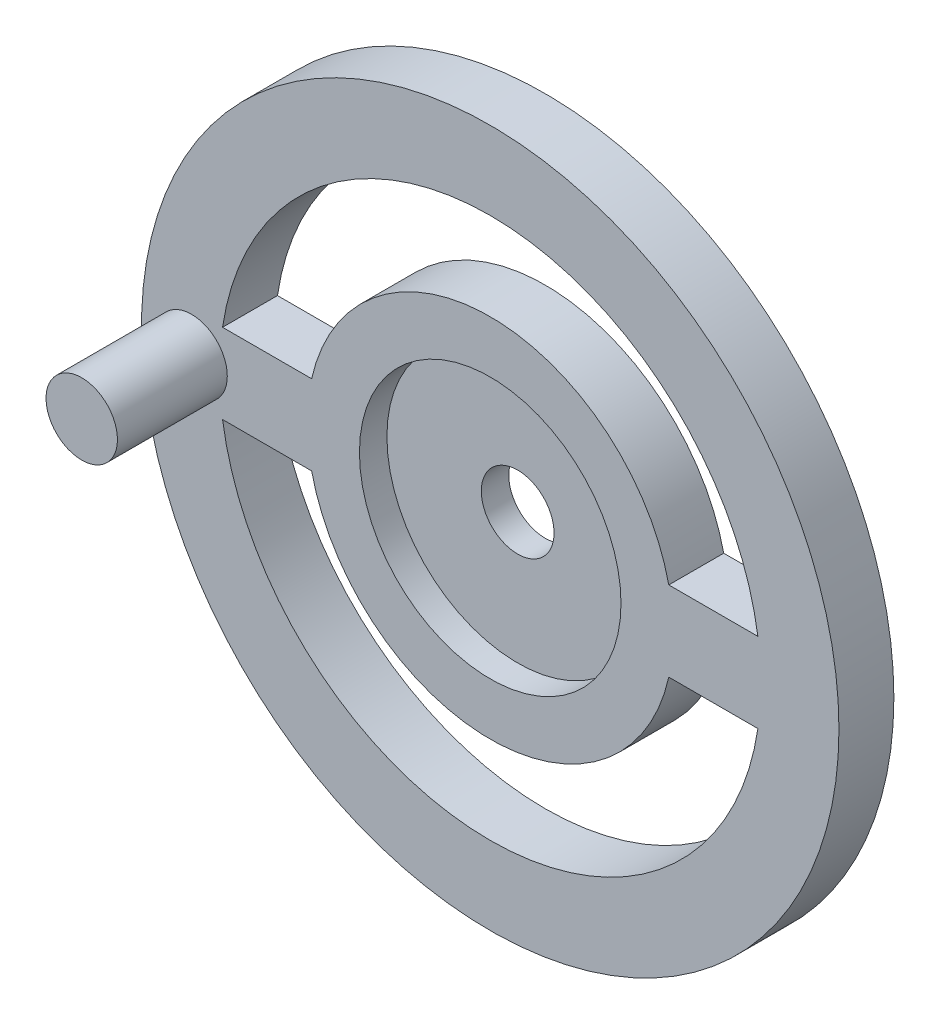
ISO-10303-21;
HEADER;
FILE_DESCRIPTION(('STEP AP214'),'2;1');
FILE_NAME('part.step','',(''),(''),'','','');
FILE_SCHEMA(('AUTOMOTIVE_DESIGN { 1 0 10303 214 1 1 1 1 }'));
ENDSEC;
DATA;
#1=APPLICATION_CONTEXT('core data for automotive mechanical design processes');
#2=APPLICATION_PROTOCOL_DEFINITION('international standard','automotive_design',2000,#1);
#3=PRODUCT_CONTEXT('',#1,'mechanical');
#4=PRODUCT('Part','Part','',(#3));
#5=PRODUCT_RELATED_PRODUCT_CATEGORY('part','',(#4));
#6=PRODUCT_DEFINITION_FORMATION('','',#4);
#7=PRODUCT_DEFINITION_CONTEXT('part definition',#1,'design');
#8=PRODUCT_DEFINITION('design','',#6,#7);
#9=PRODUCT_DEFINITION_SHAPE('','',#8);
#10=(LENGTH_UNIT() NAMED_UNIT(*) SI_UNIT(.MILLI.,.METRE.));
#11=(NAMED_UNIT(*) PLANE_ANGLE_UNIT() SI_UNIT($,.RADIAN.));
#12=(NAMED_UNIT(*) SI_UNIT($,.STERADIAN.) SOLID_ANGLE_UNIT());
#13=UNCERTAINTY_MEASURE_WITH_UNIT(LENGTH_MEASURE(1.E-05),#10,'distance_accuracy_value','');
#14=(GEOMETRIC_REPRESENTATION_CONTEXT(3) GLOBAL_UNCERTAINTY_ASSIGNED_CONTEXT((#13)) GLOBAL_UNIT_ASSIGNED_CONTEXT((#10,
#11,#12)) REPRESENTATION_CONTEXT('',''));
#15=CARTESIAN_POINT('',(0.,0.,0.));
#16=DIRECTION('',(0.,0.,1.));
#17=DIRECTION('',(1.,0.,0.));
#18=AXIS2_PLACEMENT_3D('',#15,#16,#17);
#19=CARTESIAN_POINT('',(674.616590385482,-1255.03673865925,4.));
#20=DIRECTION('',(0.,0.,1.));
#21=DIRECTION('',(1.,0.,0.));
#22=AXIS2_PLACEMENT_3D('',#19,#20,#21);
#23=PLANE('',#22);
#24=CARTESIAN_POINT('',(674.616590385482,-1255.03673865925,4.));
#25=DIRECTION('',(0.,0.,1.));
#26=DIRECTION('',(1.,0.,0.));
#27=AXIS2_PLACEMENT_3D('',#24,#25,#26);
#28=CIRCLE('',#27,9.52500000000005);
#29=CARTESIAN_POINT('',(684.141590385482,-1255.03673865925,4.));
#30=VERTEX_POINT('',#29);
#31=EDGE_CURVE('E49',#30,#30,#28,.T.);
#32=ORIENTED_EDGE('',*,*,#31,.F.);
#33=EDGE_LOOP('',(#32));
#34=FACE_BOUND('',#33,.T.);
#35=CARTESIAN_POINT('',(652.866731086859,-1255.03673865925,4.));
#36=DIRECTION('',(0.,0.,1.));
#37=DIRECTION('',(1.,0.,0.));
#38=AXIS2_PLACEMENT_3D('',#35,#36,#37);
#39=CIRCLE('',#38,2.60000000000008);
#40=CARTESIAN_POINT('',(655.466731086859,-1255.03673865925,4.));
#41=VERTEX_POINT('',#40);
#42=EDGE_CURVE('E220',#41,#41,#39,.T.);
#43=ORIENTED_EDGE('',*,*,#42,.F.);
#44=EDGE_LOOP('',(#43));
#45=FACE_BOUND('',#44,.T.);
#46=DIRECTION('',(1.,0.,0.));
#47=VECTOR('',#46,1.);
#48=CARTESIAN_POINT('',(694.110809965282,-1252.12881268514,4.));
#49=LINE('',#48,#47);
#50=CARTESIAN_POINT('',(687.622405761052,-1252.12881268514,4.));
#51=VERTEX_POINT('',#50);
#52=CARTESIAN_POINT('',(694.110809965282,-1252.12881268514,4.));
#53=VERTEX_POINT('',#52);
#54=EDGE_CURVE('E170',#51,#53,#49,.T.);
#55=ORIENTED_EDGE('',*,*,#54,.F.);
#56=CARTESIAN_POINT('',(674.616590385482,-1255.03673865925,4.));
#57=DIRECTION('',(0.,0.,-1.));
#58=DIRECTION('',(1.,0.,0.));
#59=AXIS2_PLACEMENT_3D('',#56,#57,#58);
#60=CIRCLE('',#59,13.3269376472712);
#61=CARTESIAN_POINT('',(661.610775009912,-1252.12881268514,4.));
#62=VERTEX_POINT('',#61);
#63=EDGE_CURVE('E167',#62,#51,#60,.T.);
#64=ORIENTED_EDGE('',*,*,#63,.F.);
#65=DIRECTION('',(1.,0.,0.));
#66=VECTOR('',#65,1.);
#67=CARTESIAN_POINT('',(661.610775009912,-1252.12881268514,4.));
#68=LINE('',#67,#66);
#69=CARTESIAN_POINT('',(655.122370805682,-1252.12881268514,4.));
#70=VERTEX_POINT('',#69);
#71=EDGE_CURVE('E178',#70,#62,#68,.T.);
#72=ORIENTED_EDGE('',*,*,#71,.F.);
#73=CARTESIAN_POINT('',(674.616590385482,-1255.03673865925,4.));
#74=DIRECTION('',(0.,0.,1.));
#75=DIRECTION('',(1.,0.,0.));
#76=AXIS2_PLACEMENT_3D('',#73,#74,#75);
#77=CIRCLE('',#76,19.7099119860112);
#78=EDGE_CURVE('E174',#53,#70,#77,.T.);
#79=ORIENTED_EDGE('',*,*,#78,.F.);
#80=EDGE_LOOP('',(#55,#64,#72,#79));
#81=FACE_BOUND('',#80,.T.);
#82=CARTESIAN_POINT('',(674.616590385482,-1255.03673865925,4.));
#83=DIRECTION('',(0.,0.,1.));
#84=DIRECTION('',(1.,0.,0.));
#85=AXIS2_PLACEMENT_3D('',#82,#83,#84);
#86=CIRCLE('',#85,25.4000000000007);
#87=CARTESIAN_POINT('',(700.016590385483,-1255.03673865925,4.));
#88=VERTEX_POINT('',#87);
#89=EDGE_CURVE('E11',#88,#88,#86,.T.);
#90=ORIENTED_EDGE('',*,*,#89,.T.);
#91=EDGE_LOOP('',(#90));
#92=FACE_BOUND('',#91,.T.);
#93=DIRECTION('',(-1.,0.,0.));
#94=VECTOR('',#93,1.);
#95=CARTESIAN_POINT('',(661.610775009913,-1257.94466463335,4.));
#96=LINE('',#95,#94);
#97=CARTESIAN_POINT('',(661.610775009913,-1257.94466463335,4.));
#98=VERTEX_POINT('',#97);
#99=CARTESIAN_POINT('',(655.122370805682,-1257.94466463335,4.));
#100=VERTEX_POINT('',#99);
#101=EDGE_CURVE('E122',#98,#100,#96,.T.);
#102=ORIENTED_EDGE('',*,*,#101,.F.);
#103=CARTESIAN_POINT('',(674.616590385482,-1255.03673865925,4.));
#104=DIRECTION('',(0.,0.,-1.));
#105=DIRECTION('',(1.,0.,0.));
#106=AXIS2_PLACEMENT_3D('',#103,#104,#105);
#107=CIRCLE('',#106,13.3269376472713);
#108=CARTESIAN_POINT('',(687.622405761052,-1257.94466463335,4.));
#109=VERTEX_POINT('',#108);
#110=EDGE_CURVE('E113',#109,#98,#107,.T.);
#111=ORIENTED_EDGE('',*,*,#110,.F.);
#112=DIRECTION('',(-1.,0.,0.));
#113=VECTOR('',#112,1.);
#114=CARTESIAN_POINT('',(694.110809965282,-1257.94466463335,4.));
#115=LINE('',#114,#113);
#116=CARTESIAN_POINT('',(694.110809965282,-1257.94466463335,4.));
#117=VERTEX_POINT('',#116);
#118=EDGE_CURVE('E139',#117,#109,#115,.T.);
#119=ORIENTED_EDGE('',*,*,#118,.F.);
#120=CARTESIAN_POINT('',(674.616590385482,-1255.03673865925,4.));
#121=DIRECTION('',(0.,0.,1.));
#122=DIRECTION('',(1.,0.,0.));
#123=AXIS2_PLACEMENT_3D('',#120,#121,#122);
#124=CIRCLE('',#123,19.7099119860111);
#125=EDGE_CURVE('E135',#100,#117,#124,.T.);
#126=ORIENTED_EDGE('',*,*,#125,.F.);
#127=EDGE_LOOP('',(#102,#111,#119,#126));
#128=FACE_BOUND('',#127,.T.);
#129=ADVANCED_FACE('F45',(#34,#45,#81,#92,#128),#23,.T.);
#130=CARTESIAN_POINT('',(674.616590385482,-1255.03673865925,0.));
#131=DIRECTION('',(0.,0.,1.));
#132=DIRECTION('',(1.,0.,0.));
#133=AXIS2_PLACEMENT_3D('',#130,#131,#132);
#134=PLANE('',#133);
#135=CARTESIAN_POINT('',(674.616590385482,-1255.03673865925,0.));
#136=DIRECTION('',(0.,0.,1.));
#137=DIRECTION('',(1.,0.,0.));
#138=AXIS2_PLACEMENT_3D('',#135,#136,#137);
#139=CIRCLE('',#138,2.65000000000069);
#140=CARTESIAN_POINT('',(677.266590385483,-1255.03673865925,0.));
#141=VERTEX_POINT('',#140);
#142=EDGE_CURVE('E131',#141,#141,#139,.T.);
#143=ORIENTED_EDGE('',*,*,#142,.T.);
#144=EDGE_LOOP('',(#143));
#145=FACE_BOUND('',#144,.T.);
#146=CARTESIAN_POINT('',(674.616590385482,-1255.03673865925,0.));
#147=DIRECTION('',(0.,0.,-1.));
#148=DIRECTION('',(1.,0.,0.));
#149=AXIS2_PLACEMENT_3D('',#146,#147,#148);
#150=CIRCLE('',#149,13.3269376472712);
#151=CARTESIAN_POINT('',(661.610775009912,-1252.12881268514,0.));
#152=VERTEX_POINT('',#151);
#153=CARTESIAN_POINT('',(687.622405761052,-1252.12881268514,0.));
#154=VERTEX_POINT('',#153);
#155=EDGE_CURVE('E166',#152,#154,#150,.T.);
#156=ORIENTED_EDGE('',*,*,#155,.T.);
#157=DIRECTION('',(1.,0.,0.));
#158=VECTOR('',#157,1.);
#159=CARTESIAN_POINT('',(694.110809965282,-1252.12881268514,0.));
#160=LINE('',#159,#158);
#161=CARTESIAN_POINT('',(694.110809965282,-1252.12881268514,0.));
#162=VERTEX_POINT('',#161);
#163=EDGE_CURVE('E185',#154,#162,#160,.T.);
#164=ORIENTED_EDGE('',*,*,#163,.T.);
#165=CARTESIAN_POINT('',(674.616590385482,-1255.03673865925,0.));
#166=DIRECTION('',(0.,0.,1.));
#167=DIRECTION('',(1.,0.,0.));
#168=AXIS2_PLACEMENT_3D('',#165,#166,#167);
#169=CIRCLE('',#168,19.7099119860112);
#170=CARTESIAN_POINT('',(655.122370805682,-1252.12881268514,0.));
#171=VERTEX_POINT('',#170);
#172=EDGE_CURVE('E189',#162,#171,#169,.T.);
#173=ORIENTED_EDGE('',*,*,#172,.T.);
#174=DIRECTION('',(1.,0.,0.));
#175=VECTOR('',#174,1.);
#176=CARTESIAN_POINT('',(661.610775009912,-1252.12881268514,0.));
#177=LINE('',#176,#175);
#178=EDGE_CURVE('E171',#171,#152,#177,.T.);
#179=ORIENTED_EDGE('',*,*,#178,.T.);
#180=EDGE_LOOP('',(#156,#164,#173,#179));
#181=FACE_BOUND('',#180,.T.);
#182=CARTESIAN_POINT('',(674.616590385482,-1255.03673865925,0.));
#183=DIRECTION('',(0.,0.,1.));
#184=DIRECTION('',(1.,0.,0.));
#185=AXIS2_PLACEMENT_3D('',#182,#183,#184);
#186=CIRCLE('',#185,25.4000000000007);
#187=CARTESIAN_POINT('',(700.016590385483,-1255.03673865925,0.));
#188=VERTEX_POINT('',#187);
#189=EDGE_CURVE('E55',#188,#188,#186,.T.);
#190=ORIENTED_EDGE('',*,*,#189,.F.);
#191=EDGE_LOOP('',(#190));
#192=FACE_BOUND('',#191,.T.);
#193=CARTESIAN_POINT('',(674.616590385482,-1255.03673865925,0.));
#194=DIRECTION('',(0.,0.,-1.));
#195=DIRECTION('',(1.,0.,0.));
#196=AXIS2_PLACEMENT_3D('',#193,#194,#195);
#197=CIRCLE('',#196,13.3269376472713);
#198=CARTESIAN_POINT('',(687.622405761052,-1257.94466463335,0.));
#199=VERTEX_POINT('',#198);
#200=CARTESIAN_POINT('',(661.610775009913,-1257.94466463335,0.));
#201=VERTEX_POINT('',#200);
#202=EDGE_CURVE('E71',#199,#201,#197,.T.);
#203=ORIENTED_EDGE('',*,*,#202,.T.);
#204=DIRECTION('',(-1.,0.,0.));
#205=VECTOR('',#204,1.);
#206=CARTESIAN_POINT('',(661.610775009913,-1257.94466463335,0.));
#207=LINE('',#206,#205);
#208=CARTESIAN_POINT('',(655.122370805682,-1257.94466463335,0.));
#209=VERTEX_POINT('',#208);
#210=EDGE_CURVE('E129',#201,#209,#207,.T.);
#211=ORIENTED_EDGE('',*,*,#210,.T.);
#212=CARTESIAN_POINT('',(674.616590385482,-1255.03673865925,0.));
#213=DIRECTION('',(0.,0.,1.));
#214=DIRECTION('',(1.,0.,0.));
#215=AXIS2_PLACEMENT_3D('',#212,#213,#214);
#216=CIRCLE('',#215,19.7099119860111);
#217=CARTESIAN_POINT('',(694.110809965282,-1257.94466463335,0.));
#218=VERTEX_POINT('',#217);
#219=EDGE_CURVE('E150',#209,#218,#216,.T.);
#220=ORIENTED_EDGE('',*,*,#219,.T.);
#221=DIRECTION('',(-1.,0.,0.));
#222=VECTOR('',#221,1.);
#223=CARTESIAN_POINT('',(694.110809965282,-1257.94466463335,0.));
#224=LINE('',#223,#222);
#225=EDGE_CURVE('E123',#218,#199,#224,.T.);
#226=ORIENTED_EDGE('',*,*,#225,.T.);
#227=EDGE_LOOP('',(#203,#211,#220,#226));
#228=FACE_BOUND('',#227,.T.);
#229=ADVANCED_FACE('F236',(#145,#181,#192,#228),#134,.F.);
#230=CARTESIAN_POINT('',(674.616590385482,-1255.03673865925,4.));
#231=DIRECTION('',(0.,0.,-1.));
#232=DIRECTION('',(-1.,0.,0.));
#233=AXIS2_PLACEMENT_3D('',#230,#231,#232);
#234=CYLINDRICAL_SURFACE('',#233,25.4000000000007);
#235=ORIENTED_EDGE('',*,*,#89,.F.);
#236=EDGE_LOOP('',(#235));
#237=FACE_BOUND('',#236,.T.);
#238=ORIENTED_EDGE('',*,*,#189,.T.);
#239=EDGE_LOOP('',(#238));
#240=FACE_BOUND('',#239,.T.);
#241=ADVANCED_FACE('F47',(#237,#240),#234,.T.);
#242=CARTESIAN_POINT('',(674.616590385482,-1255.03673865925,4.));
#243=DIRECTION('',(0.,0.,-1.));
#244=DIRECTION('',(-1.,0.,0.));
#245=AXIS2_PLACEMENT_3D('',#242,#243,#244);
#246=CYLINDRICAL_SURFACE('',#245,13.3269376472712);
#247=ORIENTED_EDGE('',*,*,#155,.F.);
#248=DIRECTION('',(0.,0.,-1.));
#249=VECTOR('',#248,1.);
#250=CARTESIAN_POINT('',(661.610775009912,-1252.12881268514,4.));
#251=LINE('',#250,#249);
#252=EDGE_CURVE('E181',#62,#152,#251,.T.);
#253=ORIENTED_EDGE('',*,*,#252,.F.);
#254=ORIENTED_EDGE('',*,*,#63,.T.);
#255=DIRECTION('',(0.,0.,-1.));
#256=VECTOR('',#255,1.);
#257=CARTESIAN_POINT('',(687.622405761052,-1252.12881268514,4.));
#258=LINE('',#257,#256);
#259=EDGE_CURVE('E205',#51,#154,#258,.T.);
#260=ORIENTED_EDGE('',*,*,#259,.T.);
#261=EDGE_LOOP('',(#247,#253,#254,#260));
#262=FACE_BOUND('',#261,.T.);
#263=ADVANCED_FACE('F247',(#262),#246,.T.);
#264=CARTESIAN_POINT('',(694.110809965282,-1252.12881268514,4.));
#265=DIRECTION('',(0.,1.,0.));
#266=DIRECTION('',(0.,0.,1.));
#267=AXIS2_PLACEMENT_3D('',#264,#265,#266);
#268=PLANE('',#267);
#269=ORIENTED_EDGE('',*,*,#163,.F.);
#270=ORIENTED_EDGE('',*,*,#259,.F.);
#271=ORIENTED_EDGE('',*,*,#54,.T.);
#272=DIRECTION('',(0.,0.,-1.));
#273=VECTOR('',#272,1.);
#274=CARTESIAN_POINT('',(694.110809965282,-1252.12881268514,4.));
#275=LINE('',#274,#273);
#276=EDGE_CURVE('E202',#53,#162,#275,.T.);
#277=ORIENTED_EDGE('',*,*,#276,.T.);
#278=EDGE_LOOP('',(#269,#270,#271,#277));
#279=FACE_BOUND('',#278,.T.);
#280=ADVANCED_FACE('F284',(#279),#268,.T.);
#281=CARTESIAN_POINT('',(674.616590385482,-1255.03673865925,4.));
#282=DIRECTION('',(0.,0.,-1.));
#283=DIRECTION('',(-1.,0.,0.));
#284=AXIS2_PLACEMENT_3D('',#281,#282,#283);
#285=CYLINDRICAL_SURFACE('',#284,19.7099119860112);
#286=ORIENTED_EDGE('',*,*,#172,.F.);
#287=ORIENTED_EDGE('',*,*,#276,.F.);
#288=ORIENTED_EDGE('',*,*,#78,.T.);
#289=DIRECTION('',(0.,0.,-1.));
#290=VECTOR('',#289,1.);
#291=CARTESIAN_POINT('',(655.122370805682,-1252.12881268514,4.));
#292=LINE('',#291,#290);
#293=EDGE_CURVE('E199',#70,#171,#292,.T.);
#294=ORIENTED_EDGE('',*,*,#293,.T.);
#295=EDGE_LOOP('',(#286,#287,#288,#294));
#296=FACE_BOUND('',#295,.T.);
#297=ADVANCED_FACE('F280',(#296),#285,.F.);
#298=CARTESIAN_POINT('',(661.610775009912,-1252.12881268514,4.));
#299=DIRECTION('',(0.,1.,0.));
#300=DIRECTION('',(0.,0.,1.));
#301=AXIS2_PLACEMENT_3D('',#298,#299,#300);
#302=PLANE('',#301);
#303=ORIENTED_EDGE('',*,*,#178,.F.);
#304=ORIENTED_EDGE('',*,*,#293,.F.);
#305=ORIENTED_EDGE('',*,*,#71,.T.);
#306=ORIENTED_EDGE('',*,*,#252,.T.);
#307=EDGE_LOOP('',(#303,#304,#305,#306));
#308=FACE_BOUND('',#307,.T.);
#309=ADVANCED_FACE('F276',(#308),#302,.T.);
#310=CARTESIAN_POINT('',(674.616590385482,-1255.03673865925,4.));
#311=DIRECTION('',(0.,0.,-1.));
#312=DIRECTION('',(-1.,0.,0.));
#313=AXIS2_PLACEMENT_3D('',#310,#311,#312);
#314=CYLINDRICAL_SURFACE('',#313,2.65000000000069);
#315=CARTESIAN_POINT('',(674.616590385482,-1255.03673865925,2.));
#316=DIRECTION('',(0.,0.,-1.));
#317=DIRECTION('',(-1.,0.,0.));
#318=AXIS2_PLACEMENT_3D('',#315,#316,#317);
#319=CIRCLE('',#318,2.65000000000069);
#320=CARTESIAN_POINT('',(671.966590385482,-1255.03673865925,2.));
#321=VERTEX_POINT('',#320);
#322=EDGE_CURVE('E211',#321,#321,#319,.T.);
#323=ORIENTED_EDGE('',*,*,#322,.F.);
#324=EDGE_LOOP('',(#323));
#325=FACE_BOUND('',#324,.T.);
#326=ORIENTED_EDGE('',*,*,#142,.F.);
#327=EDGE_LOOP('',(#326));
#328=FACE_BOUND('',#327,.T.);
#329=ADVANCED_FACE('F273',(#325,#328),#314,.F.);
#330=CARTESIAN_POINT('',(674.616590385482,-1255.03673865925,4.));
#331=DIRECTION('',(0.,0.,-1.));
#332=DIRECTION('',(-1.,0.,0.));
#333=AXIS2_PLACEMENT_3D('',#330,#331,#332);
#334=CYLINDRICAL_SURFACE('',#333,13.3269376472713);
#335=ORIENTED_EDGE('',*,*,#202,.F.);
#336=DIRECTION('',(0.,0.,-1.));
#337=VECTOR('',#336,1.);
#338=CARTESIAN_POINT('',(687.622405761052,-1257.94466463335,4.));
#339=LINE('',#338,#337);
#340=EDGE_CURVE('E117',#109,#199,#339,.T.);
#341=ORIENTED_EDGE('',*,*,#340,.F.);
#342=ORIENTED_EDGE('',*,*,#110,.T.);
#343=DIRECTION('',(0.,0.,-1.));
#344=VECTOR('',#343,1.);
#345=CARTESIAN_POINT('',(661.610775009913,-1257.94466463335,4.));
#346=LINE('',#345,#344);
#347=EDGE_CURVE('E116',#98,#201,#346,.T.);
#348=ORIENTED_EDGE('',*,*,#347,.T.);
#349=EDGE_LOOP('',(#335,#341,#342,#348));
#350=FACE_BOUND('',#349,.T.);
#351=ADVANCED_FACE('F115',(#350),#334,.T.);
#352=CARTESIAN_POINT('',(661.610775009913,-1257.94466463335,4.));
#353=DIRECTION('',(0.,-1.,0.));
#354=DIRECTION('',(0.,0.,-1.));
#355=AXIS2_PLACEMENT_3D('',#352,#353,#354);
#356=PLANE('',#355);
#357=ORIENTED_EDGE('',*,*,#210,.F.);
#358=ORIENTED_EDGE('',*,*,#347,.F.);
#359=ORIENTED_EDGE('',*,*,#101,.T.);
#360=DIRECTION('',(0.,0.,-1.));
#361=VECTOR('',#360,1.);
#362=CARTESIAN_POINT('',(655.122370805682,-1257.94466463335,4.));
#363=LINE('',#362,#361);
#364=EDGE_CURVE('E132',#100,#209,#363,.T.);
#365=ORIENTED_EDGE('',*,*,#364,.T.);
#366=EDGE_LOOP('',(#357,#358,#359,#365));
#367=FACE_BOUND('',#366,.T.);
#368=ADVANCED_FACE('F126',(#367),#356,.T.);
#369=CARTESIAN_POINT('',(674.616590385482,-1255.03673865925,4.));
#370=DIRECTION('',(0.,0.,-1.));
#371=DIRECTION('',(-1.,0.,0.));
#372=AXIS2_PLACEMENT_3D('',#369,#370,#371);
#373=CYLINDRICAL_SURFACE('',#372,19.7099119860111);
#374=ORIENTED_EDGE('',*,*,#219,.F.);
#375=ORIENTED_EDGE('',*,*,#364,.F.);
#376=ORIENTED_EDGE('',*,*,#125,.T.);
#377=DIRECTION('',(0.,0.,-1.));
#378=VECTOR('',#377,1.);
#379=CARTESIAN_POINT('',(694.110809965282,-1257.94466463335,4.));
#380=LINE('',#379,#378);
#381=EDGE_CURVE('E63',#117,#218,#380,.T.);
#382=ORIENTED_EDGE('',*,*,#381,.T.);
#383=EDGE_LOOP('',(#374,#375,#376,#382));
#384=FACE_BOUND('',#383,.T.);
#385=ADVANCED_FACE('F256',(#384),#373,.F.);
#386=CARTESIAN_POINT('',(694.110809965282,-1257.94466463335,4.));
#387=DIRECTION('',(0.,-1.,0.));
#388=DIRECTION('',(1.,0.,0.));
#389=AXIS2_PLACEMENT_3D('',#386,#387,#388);
#390=PLANE('',#389);
#391=ORIENTED_EDGE('',*,*,#225,.F.);
#392=ORIENTED_EDGE('',*,*,#381,.F.);
#393=ORIENTED_EDGE('',*,*,#118,.T.);
#394=ORIENTED_EDGE('',*,*,#340,.T.);
#395=EDGE_LOOP('',(#391,#392,#393,#394));
#396=FACE_BOUND('',#395,.T.);
#397=ADVANCED_FACE('F254',(#396),#390,.T.);
#398=CARTESIAN_POINT('',(652.866731086859,-1255.03673865925,12.));
#399=DIRECTION('',(0.,0.,-1.));
#400=DIRECTION('',(-1.,0.,0.));
#401=AXIS2_PLACEMENT_3D('',#398,#399,#400);
#402=CYLINDRICAL_SURFACE('',#401,2.60000000000008);
#403=CARTESIAN_POINT('',(652.866731086859,-1255.03673865925,12.));
#404=DIRECTION('',(0.,0.,1.));
#405=DIRECTION('',(1.,0.,0.));
#406=AXIS2_PLACEMENT_3D('',#403,#404,#405);
#407=CIRCLE('',#406,2.60000000000008);
#408=CARTESIAN_POINT('',(655.466731086859,-1255.03673865925,12.));
#409=VERTEX_POINT('',#408);
#410=EDGE_CURVE('E147',#409,#409,#407,.T.);
#411=ORIENTED_EDGE('',*,*,#410,.F.);
#412=EDGE_LOOP('',(#411));
#413=FACE_BOUND('',#412,.T.);
#414=ORIENTED_EDGE('',*,*,#42,.T.);
#415=EDGE_LOOP('',(#414));
#416=FACE_BOUND('',#415,.T.);
#417=ADVANCED_FACE('F232',(#413,#416),#402,.T.);
#418=CARTESIAN_POINT('',(652.866731086859,-1255.03673865925,12.));
#419=DIRECTION('',(0.,0.,1.));
#420=DIRECTION('',(1.,0.,0.));
#421=AXIS2_PLACEMENT_3D('',#418,#419,#420);
#422=PLANE('',#421);
#423=ORIENTED_EDGE('',*,*,#410,.T.);
#424=EDGE_LOOP('',(#423));
#425=FACE_BOUND('',#424,.T.);
#426=ADVANCED_FACE('F262',(#425),#422,.T.);
#427=CARTESIAN_POINT('',(674.616590385482,-1255.03673865925,12.));
#428=DIRECTION('',(0.,0.,-1.));
#429=DIRECTION('',(-1.,0.,0.));
#430=AXIS2_PLACEMENT_3D('',#427,#428,#429);
#431=CYLINDRICAL_SURFACE('',#430,9.52500000000005);
#432=ORIENTED_EDGE('',*,*,#31,.T.);
#433=EDGE_LOOP('',(#432));
#434=FACE_BOUND('',#433,.T.);
#435=CARTESIAN_POINT('',(674.616590385482,-1255.03673865925,2.));
#436=DIRECTION('',(0.,0.,-1.));
#437=DIRECTION('',(-1.,0.,0.));
#438=AXIS2_PLACEMENT_3D('',#435,#436,#437);
#439=CIRCLE('',#438,9.52500000000005);
#440=CARTESIAN_POINT('',(665.091590385482,-1255.03673865925,2.));
#441=VERTEX_POINT('',#440);
#442=EDGE_CURVE('E214',#441,#441,#439,.T.);
#443=ORIENTED_EDGE('',*,*,#442,.T.);
#444=EDGE_LOOP('',(#443));
#445=FACE_BOUND('',#444,.T.);
#446=ADVANCED_FACE('F353',(#434,#445),#431,.F.);
#447=CARTESIAN_POINT('',(674.616590385482,-1255.03673865925,2.));
#448=DIRECTION('',(0.,0.,-1.));
#449=DIRECTION('',(-1.,0.,0.));
#450=AXIS2_PLACEMENT_3D('',#447,#448,#449);
#451=PLANE('',#450);
#452=ORIENTED_EDGE('',*,*,#322,.T.);
#453=EDGE_LOOP('',(#452));
#454=FACE_BOUND('',#453,.T.);
#455=ORIENTED_EDGE('',*,*,#442,.F.);
#456=EDGE_LOOP('',(#455));
#457=FACE_BOUND('',#456,.T.);
#458=ADVANCED_FACE('F362',(#454,#457),#451,.F.);
#459=CLOSED_SHELL('',(#129,#229,#241,#263,#280,#297,#309,#329,#351,#368,#385,#397,#417,#426,
#446,#458));
#460=MANIFOLD_SOLID_BREP('B2',#459);
#461=ADVANCED_BREP_SHAPE_REPRESENTATION('',(#18,#460),#14);
#462=SHAPE_DEFINITION_REPRESENTATION(#9,#461);
ENDSEC;
END-ISO-10303-21;
